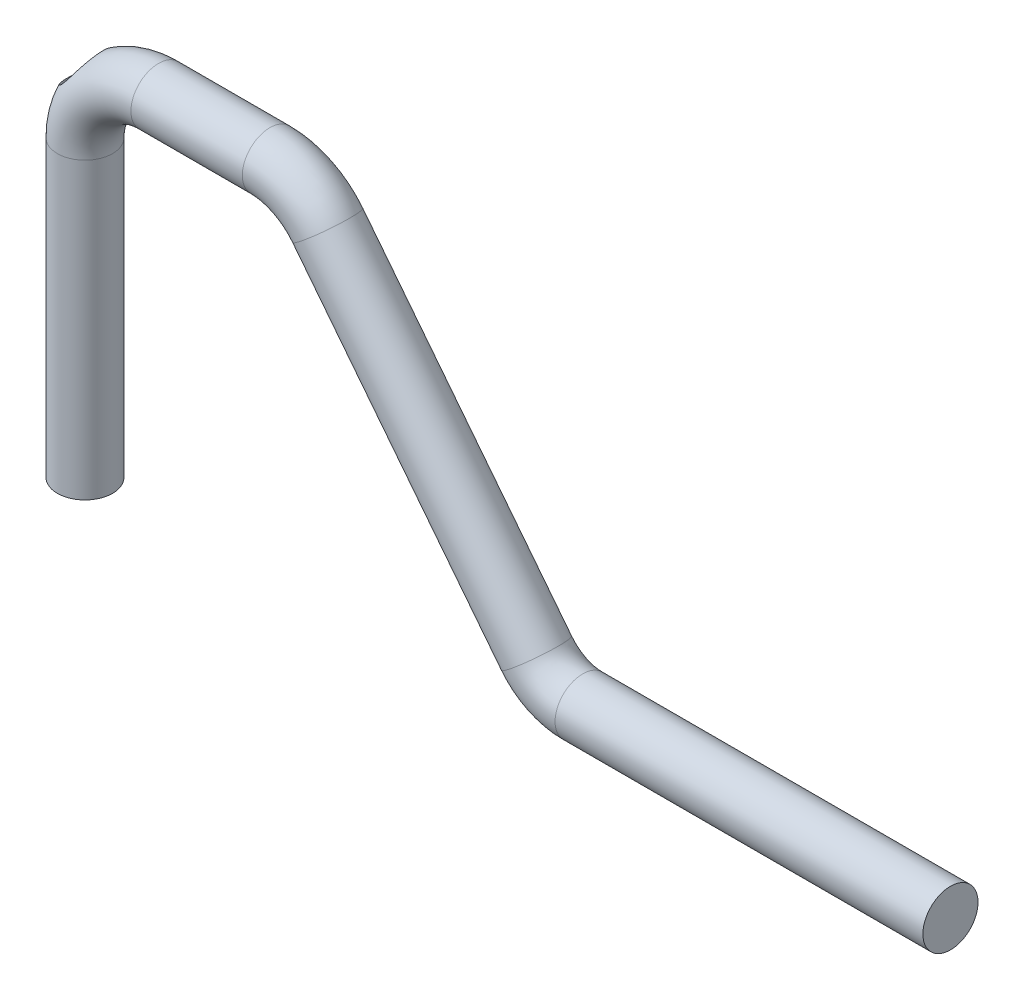
ISO-10303-21;
HEADER;
FILE_DESCRIPTION(('STEP AP214'),'2;1');
FILE_NAME('part.step','',(''),(''),'','','');
FILE_SCHEMA(('AUTOMOTIVE_DESIGN { 1 0 10303 214 1 1 1 1 }'));
ENDSEC;
DATA;
#1=APPLICATION_CONTEXT('core data for automotive mechanical design processes');
#2=APPLICATION_PROTOCOL_DEFINITION('international standard','automotive_design',2000,#1);
#3=PRODUCT_CONTEXT('',#1,'mechanical');
#4=PRODUCT('Part','Part','',(#3));
#5=PRODUCT_RELATED_PRODUCT_CATEGORY('part','',(#4));
#6=PRODUCT_DEFINITION_FORMATION('','',#4);
#7=PRODUCT_DEFINITION_CONTEXT('part definition',#1,'design');
#8=PRODUCT_DEFINITION('design','',#6,#7);
#9=PRODUCT_DEFINITION_SHAPE('','',#8);
#10=(LENGTH_UNIT() NAMED_UNIT(*) SI_UNIT(.MILLI.,.METRE.));
#11=(NAMED_UNIT(*) PLANE_ANGLE_UNIT() SI_UNIT($,.RADIAN.));
#12=(NAMED_UNIT(*) SI_UNIT($,.STERADIAN.) SOLID_ANGLE_UNIT());
#13=UNCERTAINTY_MEASURE_WITH_UNIT(LENGTH_MEASURE(1.E-05),#10,'distance_accuracy_value','');
#14=(GEOMETRIC_REPRESENTATION_CONTEXT(3) GLOBAL_UNCERTAINTY_ASSIGNED_CONTEXT((#13)) GLOBAL_UNIT_ASSIGNED_CONTEXT((#10,
#11,#12)) REPRESENTATION_CONTEXT('',''));
#15=CARTESIAN_POINT('',(0.,0.,0.));
#16=DIRECTION('',(0.,0.,1.));
#17=DIRECTION('',(1.,0.,0.));
#18=AXIS2_PLACEMENT_3D('',#15,#16,#17);
#19=CARTESIAN_POINT('',(171.839852681155,17.6650126646797,0.));
#20=DIRECTION('',(1.,0.,0.));
#21=DIRECTION('',(0.,1.,0.));
#22=AXIS2_PLACEMENT_3D('',#19,#20,#21);
#23=CYLINDRICAL_SURFACE('',#22,9.525);
#24=CARTESIAN_POINT('',(171.839852681155,17.6650126646797,0.));
#25=DIRECTION('',(1.,0.,0.));
#26=DIRECTION('',(0.,0.,1.));
#27=AXIS2_PLACEMENT_3D('',#24,#25,#26);
#28=CIRCLE('',#27,9.525);
#29=CARTESIAN_POINT('',(171.839852681155,8.14001266467972,0.));
#30=VERTEX_POINT('',#29);
#31=EDGE_CURVE('E37',#30,#30,#28,.T.);
#32=ORIENTED_EDGE('',*,*,#31,.T.);
#33=EDGE_LOOP('',(#32));
#34=FACE_BOUND('',#33,.T.);
#35=CARTESIAN_POINT('',(298.839852681155,17.6650126646797,0.));
#36=DIRECTION('',(1.,0.,0.));
#37=DIRECTION('',(0.,0.,1.));
#38=AXIS2_PLACEMENT_3D('',#35,#36,#37);
#39=CIRCLE('',#38,9.525);
#40=CARTESIAN_POINT('',(298.839852681155,17.6650126646797,9.525));
#41=VERTEX_POINT('',#40);
#42=EDGE_CURVE('E10',#41,#41,#39,.T.);
#43=ORIENTED_EDGE('',*,*,#42,.F.);
#44=EDGE_LOOP('',(#43));
#45=FACE_BOUND('',#44,.T.);
#46=ADVANCED_FACE('F31',(#34,#45),#23,.T.);
#47=CARTESIAN_POINT('',(171.839852681155,37.8809483147406,0.));
#48=DIRECTION('',(0.,0.,1.));
#49=DIRECTION('',(1.,0.,0.));
#50=AXIS2_PLACEMENT_3D('',#47,#48,#49);
#51=TOROIDAL_SURFACE('',#50,20.2159356500609,9.525);
#52=CARTESIAN_POINT('',(155.93670886076,25.4,0.));
#53=DIRECTION('',(0.617381680016528,-0.786663753569446,0.));
#54=DIRECTION('',(0.,0.,1.));
#55=AXIS2_PLACEMENT_3D('',#52,#53,#54);
#56=CIRCLE('',#55,9.525);
#57=CARTESIAN_POINT('',(148.443736608011,19.5194394978426,0.));
#58=VERTEX_POINT('',#57);
#59=EDGE_CURVE('E41',#58,#58,#56,.T.);
#60=CARTESIAN_POINT('',(171.839852681155,37.8809483147406,0.));
#61=DIRECTION('',(0.,0.,1.));
#62=DIRECTION('',(1.,0.,0.));
#63=AXIS2_PLACEMENT_3D('',#60,#61,#62);
#64=CIRCLE('',#63,29.7409356500609);
#65=EDGE_CURVE('',#58,#30,#64,.T.);
#66=ORIENTED_EDGE('',*,*,#59,.T.);
#67=ORIENTED_EDGE('',*,*,#31,.F.);
#68=ORIENTED_EDGE('',*,*,#65,.T.);
#69=ORIENTED_EDGE('',*,*,#65,.F.);
#70=EDGE_LOOP('',(#66,#68,#67,#69));
#71=FACE_BOUND('',#70,.T.);
#72=ADVANCED_FACE('F96',(#71),#51,.T.);
#73=CARTESIAN_POINT('',(83.8271813963288,117.28149467242,0.));
#74=DIRECTION('',(0.617381680016527,-0.786663753569446,0.));
#75=DIRECTION('',(0.786663753569446,0.617381680016528,0.));
#76=AXIS2_PLACEMENT_3D('',#73,#74,#75);
#77=CYLINDRICAL_SURFACE('',#76,9.525);
#78=CARTESIAN_POINT('',(83.8271813963288,117.28149467242,0.));
#79=DIRECTION('',(0.617381680016528,-0.786663753569446,0.));
#80=DIRECTION('',(0.,0.,1.));
#81=AXIS2_PLACEMENT_3D('',#78,#79,#80);
#82=CIRCLE('',#81,9.525);
#83=CARTESIAN_POINT('',(91.3201536490778,123.162055174577,0.));
#84=VERTEX_POINT('',#83);
#85=EDGE_CURVE('E45',#84,#84,#82,.T.);
#86=ORIENTED_EDGE('',*,*,#85,.T.);
#87=EDGE_LOOP('',(#86));
#88=FACE_BOUND('',#87,.T.);
#89=ORIENTED_EDGE('',*,*,#59,.F.);
#90=EDGE_LOOP('',(#89));
#91=FACE_BOUND('',#90,.T.);
#92=ADVANCED_FACE('F100',(#88,#91),#77,.T.);
#93=CARTESIAN_POINT('',(63.8459220556649,101.6,0.));
#94=DIRECTION('',(0.,0.,-1.));
#95=DIRECTION('',(-1.,0.,0.));
#96=AXIS2_PLACEMENT_3D('',#93,#94,#95);
#97=TOROIDAL_SURFACE('',#96,25.4,9.525);
#98=CARTESIAN_POINT('',(63.8459220556649,127.,0.));
#99=DIRECTION('',(1.,0.,0.));
#100=DIRECTION('',(0.,0.,1.));
#101=AXIS2_PLACEMENT_3D('',#98,#99,#100);
#102=CIRCLE('',#101,9.525);
#103=CARTESIAN_POINT('',(63.8459220556649,136.525,0.));
#104=VERTEX_POINT('',#103);
#105=EDGE_CURVE('E50',#104,#104,#102,.T.);
#106=CARTESIAN_POINT('',(63.8459220556649,101.6,0.));
#107=DIRECTION('',(0.,0.,-1.));
#108=DIRECTION('',(-1.,0.,0.));
#109=AXIS2_PLACEMENT_3D('',#106,#107,#108);
#110=CIRCLE('',#109,34.925);
#111=EDGE_CURVE('',#104,#84,#110,.T.);
#112=ORIENTED_EDGE('',*,*,#105,.T.);
#113=ORIENTED_EDGE('',*,*,#85,.F.);
#114=ORIENTED_EDGE('',*,*,#111,.T.);
#115=ORIENTED_EDGE('',*,*,#111,.F.);
#116=EDGE_LOOP('',(#112,#114,#113,#115));
#117=FACE_BOUND('',#116,.T.);
#118=ADVANCED_FACE('F106',(#117),#97,.T.);
#119=CARTESIAN_POINT('',(25.4,127.,0.));
#120=DIRECTION('',(1.,0.,0.));
#121=DIRECTION('',(0.,0.,-1.));
#122=AXIS2_PLACEMENT_3D('',#119,#120,#121);
#123=CYLINDRICAL_SURFACE('',#122,9.525);
#124=CARTESIAN_POINT('',(25.4,127.,0.));
#125=DIRECTION('',(1.,0.,0.));
#126=DIRECTION('',(0.,0.,1.));
#127=AXIS2_PLACEMENT_3D('',#124,#125,#126);
#128=CIRCLE('',#127,9.525);
#129=CARTESIAN_POINT('',(25.4,127.,9.525));
#130=VERTEX_POINT('',#129);
#131=EDGE_CURVE('E53',#130,#130,#128,.T.);
#132=ORIENTED_EDGE('',*,*,#131,.T.);
#133=EDGE_LOOP('',(#132));
#134=FACE_BOUND('',#133,.T.);
#135=ORIENTED_EDGE('',*,*,#105,.F.);
#136=EDGE_LOOP('',(#135));
#137=FACE_BOUND('',#136,.T.);
#138=ADVANCED_FACE('F91',(#134,#137),#123,.T.);
#139=CARTESIAN_POINT('',(25.4,101.6,0.));
#140=DIRECTION('',(0.,0.,-1.));
#141=DIRECTION('',(-1.,0.,0.));
#142=AXIS2_PLACEMENT_3D('',#139,#140,#141);
#143=TOROIDAL_SURFACE('',#142,25.4,9.525);
#144=CARTESIAN_POINT('',(-6.13091121128842,116.279074952723,-1.65361052224333));
#145=CARTESIAN_POINT('',(-6.17078466944875,116.255175831418,-1.50579417918905));
#146=CARTESIAN_POINT('',(-6.20542421789826,116.234601807467,-1.35607354765885));
#147=CARTESIAN_POINT('',(-6.26385102446301,116.200067402831,-1.05373452046423));
#148=CARTESIAN_POINT('',(-6.28763697661,116.186107818026,-0.901115778382312));
#149=CARTESIAN_POINT('',(-6.32404275842047,116.164796199169,-0.594054535517534));
#150=CARTESIAN_POINT('',(-6.3366592840426,116.157446120273,-0.439611508772412));
#151=CARTESIAN_POINT('',(-6.35056097808055,116.149349464085,-0.129986614146626));
#152=CARTESIAN_POINT('',(-6.35184210745814,116.148605240597,0.0251954973807422));
#153=CARTESIAN_POINT('',(-6.34304688452766,116.153725104433,0.335073129522653));
#154=CARTESIAN_POINT('',(-6.33297450651992,116.159586879324,0.489768801412196));
#155=CARTESIAN_POINT('',(-6.30160568399367,116.177921692885,0.797625236745941));
#156=CARTESIAN_POINT('',(-6.28030899523036,116.190394875421,0.95078596671538));
#157=CARTESIAN_POINT('',(-6.22676437247748,116.221962060217,1.25446136078771));
#158=CARTESIAN_POINT('',(-6.1945181712199,116.241055014925,1.40497643959676));
#159=CARTESIAN_POINT('',(-6.11947972184686,116.28587546608,1.70234650621538));
#160=CARTESIAN_POINT('',(-6.076687224767,116.311603119151,1.84920140752971));
#161=CARTESIAN_POINT('',(-5.98102987710877,116.36973982712,2.13846186001421));
#162=CARTESIAN_POINT('',(-5.92815129481262,116.402157995825,2.28086103365024));
#163=CARTESIAN_POINT('',(-5.81300518867301,116.47365942761,2.56013518958256));
#164=CARTESIAN_POINT('',(-5.7507344948602,116.5127449416,2.69700828690269));
#165=CARTESIAN_POINT('',(-5.61761768581825,116.597527879684,2.96431388188528));
#166=CARTESIAN_POINT('',(-5.54677476555171,116.643222841597,3.09474875378107));
#167=CARTESIAN_POINT('',(-5.39733659719036,116.741189772473,3.3485754258825));
#168=CARTESIAN_POINT('',(-5.31873854023537,116.793464126351,3.47196464846553));
#169=CARTESIAN_POINT('',(-5.15153150162402,116.906651538723,3.71576639037516));
#170=CARTESIAN_POINT('',(-5.06265083831737,116.967822943345,3.83587251843838));
#171=CARTESIAN_POINT('',(-4.87862001102701,117.096995644188,4.06736314213953));
#172=CARTESIAN_POINT('',(-4.78346733728617,117.164999680276,4.17874410689164));
#173=CARTESIAN_POINT('',(-4.5880398135911,117.307586857946,4.39241997513703));
#174=CARTESIAN_POINT('',(-4.48776493288452,117.38217003903,4.49471482406963));
#175=CARTESIAN_POINT('',(-4.28317836777834,117.53762788282,4.69008531642798));
#176=CARTESIAN_POINT('',(-4.17886594639802,117.618503696881,4.78315926560207));
#177=CARTESIAN_POINT('',(-3.93063559395909,117.815216362826,4.99069637235746));
#178=CARTESIAN_POINT('',(-3.78549709049146,117.933470784357,5.10142426841299));
#179=CARTESIAN_POINT('',(-3.49207231541873,118.179784964891,5.30660069143964));
#180=CARTESIAN_POINT('',(-3.34378518045307,118.307847439044,5.40104468686375));
#181=CARTESIAN_POINT('',(-3.04583446957941,118.572822961979,5.57450818140334));
#182=CARTESIAN_POINT('',(-2.89616968253298,118.709744598111,5.65351240704388));
#183=CARTESIAN_POINT('',(-2.59706048741815,118.99124739623,5.79700820609699));
#184=CARTESIAN_POINT('',(-2.44761616396648,119.135830965725,5.86149518414071));
#185=CARTESIAN_POINT('',(-2.080632839774,119.500577324728,6.00402333017791));
#186=CARTESIAN_POINT('',(-1.86385237580427,119.724531311323,6.0743522277653));
#187=CARTESIAN_POINT('',(-1.43523846887685,120.183430433494,6.1896601524575));
#188=CARTESIAN_POINT('',(-1.22340762702814,120.418381161575,6.23462612589833));
#189=CARTESIAN_POINT('',(-0.804857597357094,120.897314245193,6.30236476934515));
#190=CARTESIAN_POINT('',(-0.598159355603713,121.141325846664,6.32505764398441));
#191=CARTESIAN_POINT('',(-0.19076774028084,121.635235332663,6.35041449858799));
#192=CARTESIAN_POINT('',(0.00992604105580613,121.885132815407,6.3530798417253));
#193=CARTESIAN_POINT('',(0.357306730947338,122.327338712583,6.34170233972052));
#194=CARTESIAN_POINT('',(0.505214423201634,122.51880867572,6.33158054789082));
#195=CARTESIAN_POINT('',(0.798014481512037,122.903292529359,6.30137612990764));
#196=CARTESIAN_POINT('',(0.942906550162518,123.096306569567,6.2812925261091));
#197=CARTESIAN_POINT('',(1.22996042840998,123.483311563499,6.2314469461531));
#198=CARTESIAN_POINT('',(1.3721203126964,123.677303092698,6.20167839226478));
#199=CARTESIAN_POINT('',(1.65378937343196,124.065494264104,6.13257758738221));
#200=CARTESIAN_POINT('',(1.79329865719702,124.259693897549,6.09324572447489));
#201=CARTESIAN_POINT('',(2.06947091841127,124.647217001379,6.00506041036495));
#202=CARTESIAN_POINT('',(2.20614002173616,124.840541453031,5.95623047747568));
#203=CARTESIAN_POINT('',(2.47705877274687,125.226178071056,5.84875359923901));
#204=CARTESIAN_POINT('',(2.6113082811511,125.418490178706,5.79010609073913));
#205=CARTESIAN_POINT('',(2.87724431789442,125.801257511371,5.66265734795524));
#206=CARTESIAN_POINT('',(3.0089329844249,125.991714212855,5.5938650358964));
#207=CARTESIAN_POINT('',(3.26971841630007,126.370169056175,5.44554330822208));
#208=CARTESIAN_POINT('',(3.39881564284935,126.558167633376,5.36601582298485));
#209=CARTESIAN_POINT('',(3.64634370867731,126.919446152016,5.20071586479789));
#210=CARTESIAN_POINT('',(3.76494317506708,127.092921719734,5.11562540570748));
#211=CARTESIAN_POINT('',(3.99928221001089,127.436115704135,4.9345887298003));
#212=CARTESIAN_POINT('',(4.11502189699149,127.60583427637,4.83864296343456));
#213=CARTESIAN_POINT('',(4.34307877654279,127.940418667677,4.63503282776911));
#214=CARTESIAN_POINT('',(4.45539693973359,128.105285862531,4.52737182223586));
#215=CARTESIAN_POINT('',(4.67587534766795,128.428877749705,4.2992847596212));
#216=CARTESIAN_POINT('',(4.7840362243196,128.587603375569,4.17886065307215));
#217=CARTESIAN_POINT('',(4.97655932960254,128.869959019512,3.94650863361509));
#218=CARTESIAN_POINT('',(5.06176059436282,128.994850439151,3.83681359240307));
#219=CARTESIAN_POINT('',(5.22782779593972,129.238095760972,3.60726934377062));
#220=CARTESIAN_POINT('',(5.30869327859463,129.356448978335,3.48741907599665));
#221=CARTESIAN_POINT('',(5.464902149973,129.584861188775,3.23713605227189));
#222=CARTESIAN_POINT('',(5.54025565552774,129.694935388434,3.10672365962863));
#223=CARTESIAN_POINT('',(5.68426815153866,129.905090193736,2.83466214651522));
#224=CARTESIAN_POINT('',(5.75292810937764,130.005172243541,2.6930146551766));
#225=CARTESIAN_POINT('',(5.90194807440921,130.222165477674,2.35240746140092));
#226=CARTESIAN_POINT('',(5.97937212124455,130.334727443442,2.14925855876145));
#227=CARTESIAN_POINT('',(6.08143815586628,130.482943264566,1.83059540556582));
#228=CARTESIAN_POINT('',(6.11311921641643,130.528916550671,1.72203204191549));
#229=CARTESIAN_POINT('',(6.17120446384779,130.613161291263,1.50060534604133));
#230=CARTESIAN_POINT('',(6.19761101431596,130.651436195564,1.38774396694086));
#231=CARTESIAN_POINT('',(6.24483860189304,130.719860818073,1.15694646176243));
#232=CARTESIAN_POINT('',(6.26559122567489,130.749911034813,1.03896662827049));
#233=CARTESIAN_POINT('',(6.300549131317,130.800515450393,0.80008653558394));
#234=CARTESIAN_POINT('',(6.31475799855792,130.821074849349,0.6791879139276));
#235=CARTESIAN_POINT('',(6.3362234569486,130.852129204374,0.43556238128249));
#236=CARTESIAN_POINT('',(6.34348440132845,130.862630462389,0.312836664085335));
#237=CARTESIAN_POINT('',(6.35084225093075,130.873271861115,0.0667299927498766));
#238=CARTESIAN_POINT('',(6.3509401375465,130.873413421183,-0.0566508693121199));
#239=CARTESIAN_POINT('',(6.34448216919976,130.864073504137,-0.28477945369755));
#240=CARTESIAN_POINT('',(6.33889652872583,130.855995209175,-0.389615381748796));
#241=CARTESIAN_POINT('',(6.32263877494489,130.832476643099,-0.598070684138184));
#242=CARTESIAN_POINT('',(6.31196518323958,130.817034232204,-0.701689695906372));
#243=CARTESIAN_POINT('',(6.27262791309411,130.760103339555,-1.00962400805827));
#244=CARTESIAN_POINT('',(6.23664382796534,130.708005559849,-1.21114104837161));
#245=CARTESIAN_POINT('',(6.1361251523468,130.562313109158,-1.6537219388348));
#246=CARTESIAN_POINT('',(6.06656031153676,130.461393000656,-1.89117516571119));
#247=CARTESIAN_POINT('',(5.90674541064444,130.229141241353,-2.34320210810702));
#248=CARTESIAN_POINT('',(5.81645655435447,130.097752547292,-2.55773179177901));
#249=CARTESIAN_POINT('',(5.64548298106372,129.848524601732,-2.91192759101133));
#250=CARTESIAN_POINT('',(5.56813325509714,129.735646185172,-3.05681583964222));
#251=CARTESIAN_POINT('',(5.40666041936643,129.499737565248,-3.33410770920104));
#252=CARTESIAN_POINT('',(5.32253388975743,129.376702235516,-3.46650495257209));
#253=CARTESIAN_POINT('',(5.14883868471675,129.122433766022,-3.71961753857119));
#254=CARTESIAN_POINT('',(5.05926356590513,128.991190914865,-3.84031859451698));
#255=CARTESIAN_POINT('',(4.87579238766964,128.722199684945,-4.07072831422443));
#256=CARTESIAN_POINT('',(4.78189477923394,128.584448973546,-4.18043299185302));
#257=CARTESIAN_POINT('',(4.52255165539766,128.2038709671,-4.46407524258576));
#258=CARTESIAN_POINT('',(4.35372523419718,127.956002982129,-4.62819115776901));
#259=CARTESIAN_POINT('',(4.00855742464169,127.449685290399,-4.93016794381666));
#260=CARTESIAN_POINT('',(3.8322107071722,127.191228085059,-5.06800980463123));
#261=CARTESIAN_POINT('',(3.47301218019634,126.666224833552,-5.32062432162669));
#262=CARTESIAN_POINT('',(3.29014016985082,126.399654127428,-5.43531639615205));
#263=CARTESIAN_POINT('',(2.91930928152842,125.861833521664,-5.64316443443363));
#264=CARTESIAN_POINT('',(2.73135137245017,125.590584516792,-5.7363244683708));
#265=CARTESIAN_POINT('',(2.40798638869422,125.127596747767,-5.87751023670705));
#266=CARTESIAN_POINT('',(2.273816661658,124.936536744801,-5.93067629963937));
#267=CARTESIAN_POINT('',(2.00305692614408,124.553700512825,-6.02751555009434));
#268=CARTESIAN_POINT('',(1.86646675292736,124.361924235772,-6.07118808876954));
#269=CARTESIAN_POINT('',(1.59068850291223,123.978146386045,-6.14920787634564));
#270=CARTESIAN_POINT('',(1.4514987507035,123.786144748462,-6.18354887273352));
#271=CARTESIAN_POINT('',(1.17045529207766,123.402648732783,-6.2428487145609));
#272=CARTESIAN_POINT('',(1.02860167110649,123.21115433864,-6.26780786039366));
#273=CARTESIAN_POINT('',(0.74246949220376,122.829875154446,-6.30809398102983));
#274=CARTESIAN_POINT('',(0.598199619824139,122.640086936449,-6.32345001501392));
#275=CARTESIAN_POINT('',(0.306606250591528,122.262291909342,-6.3442777345531));
#276=CARTESIAN_POINT('',(0.159282562282247,122.074285213005,-6.34974879847141));
#277=CARTESIAN_POINT('',(-0.138444314937633,121.700988486517,-6.35023410648207));
#278=CARTESIAN_POINT('',(-0.28884443566534,121.5156960384,-6.34525830976766));
#279=CARTESIAN_POINT('',(-0.592933844538164,121.148522598373,-6.32409317582895));
#280=CARTESIAN_POINT('',(-0.746622442704473,120.966640905567,-6.30790616897788));
#281=CARTESIAN_POINT('',(-1.05879582193703,120.605465190583,-6.26311078295845));
#282=CARTESIAN_POINT('',(-1.21731262073343,120.426213231874,-6.23438373703903));
#283=CARTESIAN_POINT('',(-1.53744493877211,120.073251693757,-6.16324953665347));
#284=CARTESIAN_POINT('',(-1.6990602641132,119.899541769338,-6.12084323560361));
#285=CARTESIAN_POINT('',(-2.02459876453784,119.559150661122,-6.02100026108916));
#286=CARTESIAN_POINT('',(-2.18851848513369,119.392460199253,-5.96358420043337));
#287=CARTESIAN_POINT('',(-2.51785713855467,119.067259897825,-5.83217895834336));
#288=CARTESIAN_POINT('',(-2.68327582711667,118.908748752624,-5.75819243214018));
#289=CARTESIAN_POINT('',(-2.98715806110662,118.626363277694,-5.60565754914499));
#290=CARTESIAN_POINT('',(-3.12563298138686,118.501046621842,-5.52980499542802));
#291=CARTESIAN_POINT('',(-3.40127200302985,118.258068458075,-5.36466659956405));
#292=CARTESIAN_POINT('',(-3.53843638231923,118.140405294896,-5.27538367600796));
#293=CARTESIAN_POINT('',(-3.80988278550484,117.913597301967,-5.08281140873236));
#294=CARTESIAN_POINT('',(-3.94416577594211,117.804449582335,-4.979526849604));
#295=CARTESIAN_POINT('',(-4.2080612347474,117.595413333847,-4.75860411969731));
#296=CARTESIAN_POINT('',(-4.33767449097376,117.495523238568,-4.64096838501901));
#297=CARTESIAN_POINT('',(-4.57053665608317,117.320441218856,-4.41080135362187));
#298=CARTESIAN_POINT('',(-4.67474917262148,117.243824995491,-4.30032521604746));
#299=CARTESIAN_POINT('',(-4.87709828430853,117.097984552845,-4.06939462171889));
#300=CARTESIAN_POINT('',(-4.97523586291198,117.028759135764,-3.94894178748492));
#301=CARTESIAN_POINT('',(-5.16405861854402,116.897997371181,-3.69858771250227));
#302=CARTESIAN_POINT('',(-5.25475050402403,116.836454075597,-3.56869518022849));
#303=CARTESIAN_POINT('',(-5.42748882561523,116.721173881562,-3.30005746481012));
#304=CARTESIAN_POINT('',(-5.50953688835505,116.667435513626,-3.1613139551957));
#305=CARTESIAN_POINT('',(-5.70120446486884,116.543729539984,-2.80655010728604));
#306=CARTESIAN_POINT('',(-5.80494485078522,116.47849790595,-2.58563308818365));
#307=CARTESIAN_POINT('',(-5.98737618582186,116.365603442642,-2.12936050330158));
#308=CARTESIAN_POINT('',(-6.06606512968417,116.317942019739,-1.89400378348481));
#309=CARTESIAN_POINT('',(-6.13091121128842,116.279074952723,-1.65361052224333));
#310=B_SPLINE_CURVE_WITH_KNOTS('',3,(#144,#145,#146,#147,#148,#149,#150,#151,#152,#153,#154,
#155,#156,#157,#158,#159,#160,#161,#162,#163,#164,#165,#166,#167,#168,#169,#170,#171,#172,#173,
#174,#175,#176,#177,#178,#179,#180,#181,#182,#183,#184,#185,#186,#187,#188,#189,#190,#191,#192,
#193,#194,#195,#196,#197,#198,#199,#200,#201,#202,#203,#204,#205,#206,#207,#208,#209,#210,#211,
#212,#213,#214,#215,#216,#217,#218,#219,#220,#221,#222,#223,#224,#225,#226,#227,#228,#229,#230,
#231,#232,#233,#234,#235,#236,#237,#238,#239,#240,#241,#242,#243,#244,#245,#246,#247,#248,#249,
#250,#251,#252,#253,#254,#255,#256,#257,#258,#259,#260,#261,#262,#263,#264,#265,#266,#267,#268,
#269,#270,#271,#272,#273,#274,#275,#276,#277,#278,#279,#280,#281,#282,#283,#284,#285,#286,#287,
#288,#289,#290,#291,#292,#293,#294,#295,#296,#297,#298,#299,#300,#301,#302,#303,#304,#305,#306,
#307,#308,#309),.UNSPECIFIED.,.T.,.F.,(4,2,2,2,2,2,2,2,2,2,2,2,2,2,2,2,2,2,2,2,2,2,2,2,2,2,2,2,
2,2,2,2,2,2,2,2,2,2,2,2,2,2,2,2,2,2,2,2,2,2,2,2,2,2,2,2,2,2,2,2,2,2,2,2,2,2,2,2,2,2,2,2,2,2,2,2,
2,2,2,2,2,2,4),(0.,0.464650297935231,0.929356490580655,1.39420010262957,1.85920934149082,
2.32405585419738,2.78891248253948,3.25369558278009,3.71848965611751,4.18392110012801,
4.64950998676787,5.11492587476671,5.58051095652942,6.06435064185758,6.5483851259252,
7.03242251634684,7.51654867967675,8.16810917090854,8.81985068929278,9.47223370188532,
10.1248229338875,11.0818660249371,12.0394012337744,13.0003545110043,13.9612423804025,
14.6874902980142,15.413809503181,16.1406230362078,16.8674070794662,17.592413918532,
18.3174623594569,19.0418768910587,19.7661613329231,20.4460309984019,21.1258724623987,
21.8055192377787,22.4850622948959,23.0450469917492,23.6050902313829,24.16407832435,
24.722985509606,25.4545141344594,25.8203988854598,26.1861193083627,26.5560861066042,
26.9258499549741,27.2953819753341,27.6648633669067,27.9803528052166,28.2959339707467,
28.9267272170279,29.7241069432971,30.5229917508153,31.1200792047147,31.7174698833494,
32.3155813011946,32.9139087533056,33.9378635804777,34.9625564799727,35.9907569324831,
37.0187628660026,37.7368989742251,38.4550841489873,39.1737493570549,39.8923915525422,
40.6088484660569,41.3253504338784,42.0411696567518,42.7568401333698,43.4794350273584,
44.2019848490817,44.9235475631897,45.6449947375933,46.2491866003484,46.8532473536711,
47.4571022073013,48.0608546993309,48.5706386126634,49.0803397815053,49.5895765593226,
50.0987173351311,50.8543162094714,51.6099755509859),.UNSPECIFIED.);
#311=CARTESIAN_POINT('',(-6.13091121128842,116.279074952723,-1.65361052224333));
#312=VERTEX_POINT('',#311);
#313=EDGE_CURVE('E60',#312,#312,#310,.T.);
#314=ORIENTED_EDGE('',*,*,#313,.F.);
#315=EDGE_LOOP('',(#314));
#316=FACE_BOUND('',#315,.T.);
#317=CARTESIAN_POINT('',(0.,101.6,0.));
#318=DIRECTION('',(0.,1.,0.));
#319=DIRECTION('',(0.,0.,1.));
#320=AXIS2_PLACEMENT_3D('',#317,#318,#319);
#321=CIRCLE('',#320,9.525);
#322=CARTESIAN_POINT('',(0.,101.6,9.525));
#323=VERTEX_POINT('',#322);
#324=EDGE_CURVE('E56',#323,#323,#321,.T.);
#325=ORIENTED_EDGE('',*,*,#324,.T.);
#326=EDGE_LOOP('',(#325));
#327=FACE_BOUND('',#326,.T.);
#328=ORIENTED_EDGE('',*,*,#131,.F.);
#329=EDGE_LOOP('',(#328));
#330=FACE_BOUND('',#329,.T.);
#331=ADVANCED_FACE('F70',(#316,#327,#330),#143,.T.);
#332=CARTESIAN_POINT('',(0.,101.6,0.));
#333=DIRECTION('',(0.,-1.,0.));
#334=DIRECTION('',(0.,0.,-1.));
#335=AXIS2_PLACEMENT_3D('',#332,#333,#334);
#336=CYLINDRICAL_SURFACE('',#335,9.525);
#337=ORIENTED_EDGE('',*,*,#324,.F.);
#338=EDGE_LOOP('',(#337));
#339=FACE_BOUND('',#338,.T.);
#340=CARTESIAN_POINT('',(0.,0.,0.));
#341=DIRECTION('',(0.,1.,0.));
#342=DIRECTION('',(0.,0.,1.));
#343=AXIS2_PLACEMENT_3D('',#340,#341,#342);
#344=CIRCLE('',#343,9.525);
#345=CARTESIAN_POINT('',(0.,0.,9.525));
#346=VERTEX_POINT('',#345);
#347=EDGE_CURVE('E57',#346,#346,#344,.T.);
#348=ORIENTED_EDGE('',*,*,#347,.T.);
#349=EDGE_LOOP('',(#348));
#350=FACE_BOUND('',#349,.T.);
#351=ADVANCED_FACE('F83',(#339,#350),#336,.T.);
#352=CARTESIAN_POINT('',(298.839852681155,17.6650126646797,0.));
#353=DIRECTION('',(1.,0.,0.));
#354=DIRECTION('',(0.,0.,1.));
#355=AXIS2_PLACEMENT_3D('',#352,#353,#354);
#356=PLANE('',#355);
#357=ORIENTED_EDGE('',*,*,#42,.T.);
#358=EDGE_LOOP('',(#357));
#359=FACE_BOUND('',#358,.T.);
#360=ADVANCED_FACE('F80',(#359),#356,.T.);
#361=CARTESIAN_POINT('',(0.,0.,0.));
#362=DIRECTION('',(0.,1.,0.));
#363=DIRECTION('',(0.,0.,1.));
#364=AXIS2_PLACEMENT_3D('',#361,#362,#363);
#365=PLANE('',#364);
#366=CARTESIAN_POINT('',(0.,0.,0.));
#367=DIRECTION('',(0.,-1.,0.));
#368=DIRECTION('',(0.,0.,-1.));
#369=AXIS2_PLACEMENT_3D('',#366,#367,#368);
#370=CIRCLE('',#369,6.35);
#371=CARTESIAN_POINT('',(0.,0.,-6.35));
#372=VERTEX_POINT('',#371);
#373=EDGE_CURVE('E69',#372,#372,#370,.T.);
#374=ORIENTED_EDGE('',*,*,#373,.F.);
#375=EDGE_LOOP('',(#374));
#376=FACE_BOUND('',#375,.T.);
#377=ORIENTED_EDGE('',*,*,#347,.F.);
#378=EDGE_LOOP('',(#377));
#379=FACE_BOUND('',#378,.T.);
#380=ADVANCED_FACE('F78',(#376,#379),#365,.F.);
#381=CARTESIAN_POINT('',(0.,139.7,0.));
#382=DIRECTION('',(0.,-1.,0.));
#383=DIRECTION('',(0.,0.,-1.));
#384=AXIS2_PLACEMENT_3D('',#381,#382,#383);
#385=CYLINDRICAL_SURFACE('',#384,6.35);
#386=ORIENTED_EDGE('',*,*,#313,.T.);
#387=EDGE_LOOP('',(#386));
#388=FACE_BOUND('',#387,.T.);
#389=ORIENTED_EDGE('',*,*,#373,.T.);
#390=EDGE_LOOP('',(#389));
#391=FACE_BOUND('',#390,.T.);
#392=ADVANCED_FACE('F74',(#388,#391),#385,.F.);
#393=CLOSED_SHELL('',(#46,#72,#92,#118,#138,#331,#351,#360,#380,#392));
#394=MANIFOLD_SOLID_BREP('B2',#393);
#395=ADVANCED_BREP_SHAPE_REPRESENTATION('',(#18,#394),#14);
#396=SHAPE_DEFINITION_REPRESENTATION(#9,#395);
ENDSEC;
END-ISO-10303-21;
